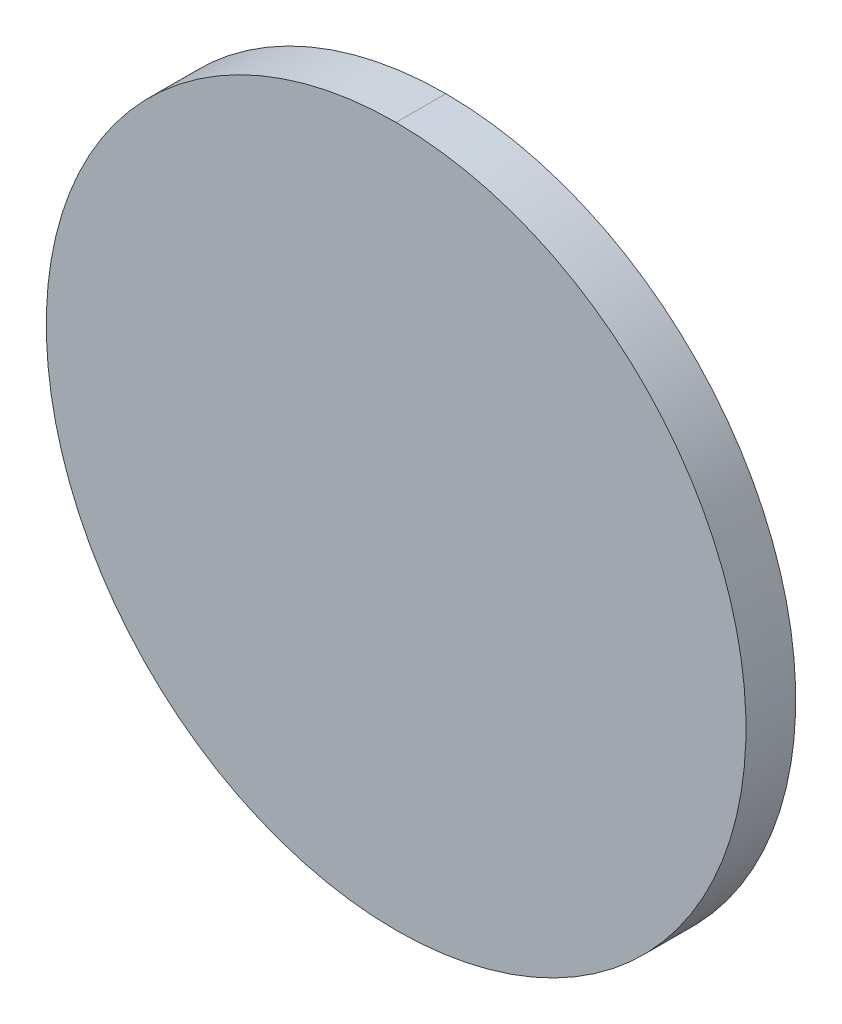
ISO-10303-21;
HEADER;
FILE_DESCRIPTION(('STEP AP214'),'2;1');
FILE_NAME('part.step','',(''),(''),'','','');
FILE_SCHEMA(('AUTOMOTIVE_DESIGN { 1 0 10303 214 1 1 1 1 }'));
ENDSEC;
DATA;
#1=APPLICATION_CONTEXT('core data for automotive mechanical design processes');
#2=APPLICATION_PROTOCOL_DEFINITION('international standard','automotive_design',2000,#1);
#3=PRODUCT_CONTEXT('',#1,'mechanical');
#4=PRODUCT('Part','Part','',(#3));
#5=PRODUCT_RELATED_PRODUCT_CATEGORY('part','',(#4));
#6=PRODUCT_DEFINITION_FORMATION('','',#4);
#7=PRODUCT_DEFINITION_CONTEXT('part definition',#1,'design');
#8=PRODUCT_DEFINITION('design','',#6,#7);
#9=PRODUCT_DEFINITION_SHAPE('','',#8);
#10=(LENGTH_UNIT() NAMED_UNIT(*) SI_UNIT(.MILLI.,.METRE.));
#11=(NAMED_UNIT(*) PLANE_ANGLE_UNIT() SI_UNIT($,.RADIAN.));
#12=(NAMED_UNIT(*) SI_UNIT($,.STERADIAN.) SOLID_ANGLE_UNIT());
#13=UNCERTAINTY_MEASURE_WITH_UNIT(LENGTH_MEASURE(1.E-05),#10,'distance_accuracy_value','');
#14=(GEOMETRIC_REPRESENTATION_CONTEXT(3) GLOBAL_UNCERTAINTY_ASSIGNED_CONTEXT((#13)) GLOBAL_UNIT_ASSIGNED_CONTEXT((#10,
#11,#12)) REPRESENTATION_CONTEXT('',''));
#15=CARTESIAN_POINT('',(0.,0.,0.));
#16=DIRECTION('',(0.,0.,1.));
#17=DIRECTION('',(1.,0.,0.));
#18=AXIS2_PLACEMENT_3D('',#15,#16,#17);
#19=CARTESIAN_POINT('',(108.71997306,115.64999476,0.));
#20=DIRECTION('',(0.,1.,0.));
#21=DIRECTION('',(1.,0.,0.));
#22=AXIS2_PLACEMENT_3D('',#19,#20,#21);
#23=PLANE('',#22);
#24=DIRECTION('',(1.,0.,0.));
#25=VECTOR('',#24,1.);
#26=CARTESIAN_POINT('',(108.71997306,115.64999476,0.03556));
#27=LINE('',#26,#25);
#28=CARTESIAN_POINT('',(108.71997306,115.64999476,0.03556));
#29=VERTEX_POINT('',#28);
#30=CARTESIAN_POINT('',(108.72002386,115.64999476,0.03556));
#31=VERTEX_POINT('',#30);
#32=EDGE_CURVE('E11',#29,#31,#27,.T.);
#33=ORIENTED_EDGE('',*,*,#32,.F.);
#34=DIRECTION('',(0.,0.,1.));
#35=VECTOR('',#34,1.);
#36=CARTESIAN_POINT('',(108.71997306,115.64999476,0.));
#37=LINE('',#36,#35);
#38=CARTESIAN_POINT('',(108.71997306,115.64999476,0.));
#39=VERTEX_POINT('',#38);
#40=EDGE_CURVE('E24',#39,#29,#37,.T.);
#41=ORIENTED_EDGE('',*,*,#40,.F.);
#42=DIRECTION('',(1.,0.,0.));
#43=VECTOR('',#42,1.);
#44=CARTESIAN_POINT('',(108.71997306,115.64999476,0.));
#45=LINE('',#44,#43);
#46=CARTESIAN_POINT('',(108.72002386,115.64999476,0.));
#47=VERTEX_POINT('',#46);
#48=EDGE_CURVE('E75',#39,#47,#45,.T.);
#49=ORIENTED_EDGE('',*,*,#48,.T.);
#50=DIRECTION('',(0.,0.,1.));
#51=VECTOR('',#50,1.);
#52=CARTESIAN_POINT('',(108.72002386,115.64999476,0.));
#53=LINE('',#52,#51);
#54=EDGE_CURVE('E37',#47,#31,#53,.T.);
#55=ORIENTED_EDGE('',*,*,#54,.T.);
#56=EDGE_LOOP('',(#33,#41,#49,#55));
#57=FACE_BOUND('',#56,.T.);
#58=ADVANCED_FACE('F17',(#57),#23,.F.);
#59=CARTESIAN_POINT('',(108.72002386,115.89999426,0.));
#60=DIRECTION('',(0.,0.,-1.));
#61=DIRECTION('',(0.,-1.,0.));
#62=AXIS2_PLACEMENT_3D('',#59,#60,#61);
#63=CYLINDRICAL_SURFACE('',#62,0.249999500000006);
#64=CARTESIAN_POINT('',(108.72002386,115.89999426,0.03556));
#65=DIRECTION('',(0.,0.,1.));
#66=DIRECTION('',(0.,-1.,0.));
#67=AXIS2_PLACEMENT_3D('',#64,#65,#66);
#68=CIRCLE('',#67,0.249999500000006);
#69=CARTESIAN_POINT('',(108.72002386,116.14999376,0.03556));
#70=VERTEX_POINT('',#69);
#71=EDGE_CURVE('E83',#31,#70,#68,.T.);
#72=ORIENTED_EDGE('',*,*,#71,.F.);
#73=ORIENTED_EDGE('',*,*,#54,.F.);
#74=CARTESIAN_POINT('',(108.72002386,115.89999426,0.));
#75=DIRECTION('',(0.,0.,1.));
#76=DIRECTION('',(0.,-1.,0.));
#77=AXIS2_PLACEMENT_3D('',#74,#75,#76);
#78=CIRCLE('',#77,0.249999500000006);
#79=CARTESIAN_POINT('',(108.72002386,116.14999376,0.));
#80=VERTEX_POINT('',#79);
#81=EDGE_CURVE('E81',#47,#80,#78,.T.);
#82=ORIENTED_EDGE('',*,*,#81,.T.);
#83=DIRECTION('',(0.,0.,1.));
#84=VECTOR('',#83,1.);
#85=CARTESIAN_POINT('',(108.72002386,116.14999376,0.));
#86=LINE('',#85,#84);
#87=EDGE_CURVE('E67',#80,#70,#86,.T.);
#88=ORIENTED_EDGE('',*,*,#87,.T.);
#89=EDGE_LOOP('',(#72,#73,#82,#88));
#90=FACE_BOUND('',#89,.T.);
#91=ADVANCED_FACE('F89',(#90),#63,.T.);
#92=CARTESIAN_POINT('',(108.72002386,116.14999376,0.));
#93=DIRECTION('',(0.,-1.,0.));
#94=DIRECTION('',(-1.,0.,0.));
#95=AXIS2_PLACEMENT_3D('',#92,#93,#94);
#96=PLANE('',#95);
#97=DIRECTION('',(-1.,0.,0.));
#98=VECTOR('',#97,1.);
#99=CARTESIAN_POINT('',(108.72002386,116.14999376,0.03556));
#100=LINE('',#99,#98);
#101=CARTESIAN_POINT('',(108.71997306,116.14999376,0.03556));
#102=VERTEX_POINT('',#101);
#103=EDGE_CURVE('E71',#70,#102,#100,.T.);
#104=ORIENTED_EDGE('',*,*,#103,.F.);
#105=ORIENTED_EDGE('',*,*,#87,.F.);
#106=DIRECTION('',(-1.,0.,0.));
#107=VECTOR('',#106,1.);
#108=CARTESIAN_POINT('',(108.72002386,116.14999376,0.));
#109=LINE('',#108,#107);
#110=CARTESIAN_POINT('',(108.71997306,116.14999376,0.));
#111=VERTEX_POINT('',#110);
#112=EDGE_CURVE('E63',#80,#111,#109,.T.);
#113=ORIENTED_EDGE('',*,*,#112,.T.);
#114=DIRECTION('',(0.,0.,1.));
#115=VECTOR('',#114,1.);
#116=CARTESIAN_POINT('',(108.71997306,116.14999376,0.));
#117=LINE('',#116,#115);
#118=EDGE_CURVE('E53',#111,#102,#117,.T.);
#119=ORIENTED_EDGE('',*,*,#118,.T.);
#120=EDGE_LOOP('',(#104,#105,#113,#119));
#121=FACE_BOUND('',#120,.T.);
#122=ADVANCED_FACE('F66',(#121),#96,.F.);
#123=CARTESIAN_POINT('',(108.71997306,115.89999426,0.));
#124=DIRECTION('',(0.,0.,-1.));
#125=DIRECTION('',(-1.13687065095746E-13,1.,0.));
#126=AXIS2_PLACEMENT_3D('',#123,#124,#125);
#127=CYLINDRICAL_SURFACE('',#126,0.249999500000011);
#128=CARTESIAN_POINT('',(108.71997306,115.89999426,0.03556));
#129=DIRECTION('',(0.,0.,1.));
#130=DIRECTION('',(-1.13687065095746E-13,1.,0.));
#131=AXIS2_PLACEMENT_3D('',#128,#129,#130);
#132=CIRCLE('',#131,0.249999500000011);
#133=EDGE_CURVE('E59',#102,#29,#132,.T.);
#134=ORIENTED_EDGE('',*,*,#133,.F.);
#135=ORIENTED_EDGE('',*,*,#118,.F.);
#136=CARTESIAN_POINT('',(108.71997306,115.89999426,0.));
#137=DIRECTION('',(0.,0.,1.));
#138=DIRECTION('',(-1.13687065095746E-13,1.,0.));
#139=AXIS2_PLACEMENT_3D('',#136,#137,#138);
#140=CIRCLE('',#139,0.249999500000011);
#141=EDGE_CURVE('E57',#111,#39,#140,.T.);
#142=ORIENTED_EDGE('',*,*,#141,.T.);
#143=ORIENTED_EDGE('',*,*,#40,.T.);
#144=EDGE_LOOP('',(#134,#135,#142,#143));
#145=FACE_BOUND('',#144,.T.);
#146=ADVANCED_FACE('F55',(#145),#127,.T.);
#147=CARTESIAN_POINT('',(108.71997306,115.64999476,0.));
#148=DIRECTION('',(0.,0.,-1.));
#149=DIRECTION('',(-1.,0.,0.));
#150=AXIS2_PLACEMENT_3D('',#147,#148,#149);
#151=PLANE('',#150);
#152=ORIENTED_EDGE('',*,*,#141,.F.);
#153=ORIENTED_EDGE('',*,*,#112,.F.);
#154=ORIENTED_EDGE('',*,*,#81,.F.);
#155=ORIENTED_EDGE('',*,*,#48,.F.);
#156=EDGE_LOOP('',(#152,#153,#154,#155));
#157=FACE_BOUND('',#156,.T.);
#158=ADVANCED_FACE('F74',(#157),#151,.T.);
#159=CARTESIAN_POINT('',(108.71997306,115.64999476,0.03556));
#160=DIRECTION('',(0.,0.,-1.));
#161=DIRECTION('',(-1.,0.,0.));
#162=AXIS2_PLACEMENT_3D('',#159,#160,#161);
#163=PLANE('',#162);
#164=ORIENTED_EDGE('',*,*,#32,.T.);
#165=ORIENTED_EDGE('',*,*,#71,.T.);
#166=ORIENTED_EDGE('',*,*,#103,.T.);
#167=ORIENTED_EDGE('',*,*,#133,.T.);
#168=EDGE_LOOP('',(#164,#165,#166,#167));
#169=FACE_BOUND('',#168,.T.);
#170=ADVANCED_FACE('F91',(#169),#163,.F.);
#171=CLOSED_SHELL('',(#58,#91,#122,#146,#158,#170));
#172=MANIFOLD_SOLID_BREP('B1',#171);
#173=ADVANCED_BREP_SHAPE_REPRESENTATION('',(#18,#172),#14);
#174=SHAPE_DEFINITION_REPRESENTATION(#9,#173);
ENDSEC;
END-ISO-10303-21;
